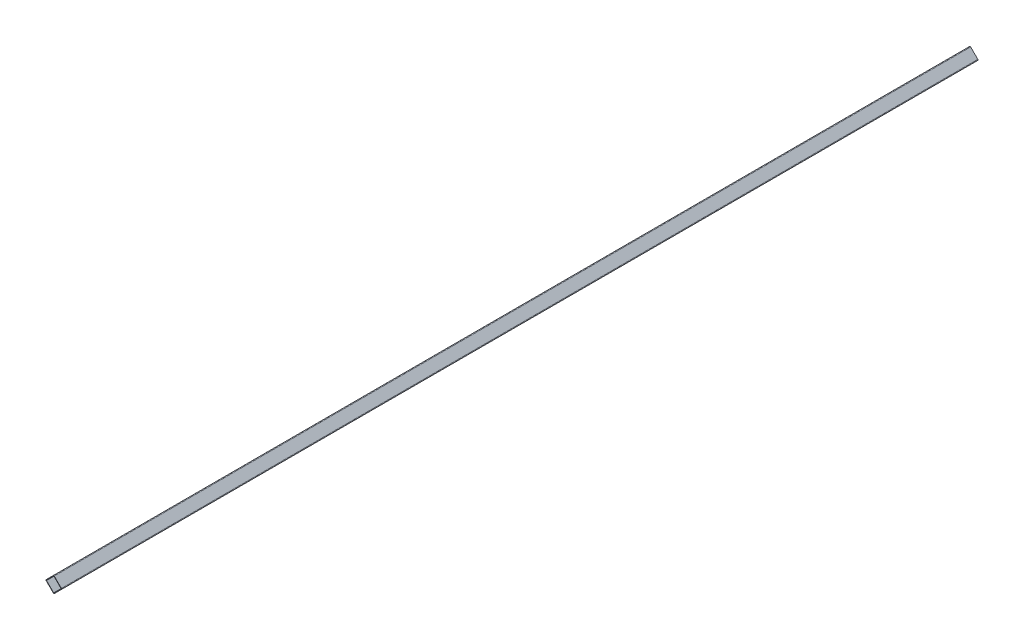
ISO-10303-21;
HEADER;
FILE_DESCRIPTION(('STEP AP214'),'2;1');
FILE_NAME('part.step','',(''),(''),'','','');
FILE_SCHEMA(('AUTOMOTIVE_DESIGN { 1 0 10303 214 1 1 1 1 }'));
ENDSEC;
DATA;
#1=APPLICATION_CONTEXT('core data for automotive mechanical design processes');
#2=APPLICATION_PROTOCOL_DEFINITION('international standard','automotive_design',2000,#1);
#3=PRODUCT_CONTEXT('',#1,'mechanical');
#4=PRODUCT('Part','Part','',(#3));
#5=PRODUCT_RELATED_PRODUCT_CATEGORY('part','',(#4));
#6=PRODUCT_DEFINITION_FORMATION('','',#4);
#7=PRODUCT_DEFINITION_CONTEXT('part definition',#1,'design');
#8=PRODUCT_DEFINITION('design','',#6,#7);
#9=PRODUCT_DEFINITION_SHAPE('','',#8);
#10=(LENGTH_UNIT() NAMED_UNIT(*) SI_UNIT(.MILLI.,.METRE.));
#11=(NAMED_UNIT(*) PLANE_ANGLE_UNIT() SI_UNIT($,.RADIAN.));
#12=(NAMED_UNIT(*) SI_UNIT($,.STERADIAN.) SOLID_ANGLE_UNIT());
#13=UNCERTAINTY_MEASURE_WITH_UNIT(LENGTH_MEASURE(1.E-05),#10,'distance_accuracy_value','');
#14=(GEOMETRIC_REPRESENTATION_CONTEXT(3) GLOBAL_UNCERTAINTY_ASSIGNED_CONTEXT((#13)) GLOBAL_UNIT_ASSIGNED_CONTEXT((#10,
#11,#12)) REPRESENTATION_CONTEXT('',''));
#15=CARTESIAN_POINT('',(0.,0.,0.));
#16=DIRECTION('',(0.,0.,1.));
#17=DIRECTION('',(1.,0.,0.));
#18=AXIS2_PLACEMENT_3D('',#15,#16,#17);
#19=CARTESIAN_POINT('',(0.,-23.5466558135256,3048.));
#20=DIRECTION('',(0.,0.,-1.));
#21=DIRECTION('',(-1.,0.,0.));
#22=AXIS2_PLACEMENT_3D('',#19,#20,#21);
#23=PLANE('',#22);
#24=CARTESIAN_POINT('',(0.,-23.5466558135256,3048.));
#25=DIRECTION('',(0.,0.,1.));
#26=DIRECTION('',(-1.,0.,0.));
#27=AXIS2_PLACEMENT_3D('',#24,#25,#26);
#28=CIRCLE('',#27,2.3999999999904);
#29=CARTESIAN_POINT('',(-1.69705627484088,-25.2437120883665,3048.));
#30=VERTEX_POINT('',#29);
#31=CARTESIAN_POINT('',(1.69705627484097,-25.2437120883665,3048.));
#32=VERTEX_POINT('',#31);
#33=EDGE_CURVE('E219',#30,#32,#28,.T.);
#34=ORIENTED_EDGE('',*,*,#33,.T.);
#35=DIRECTION('',(0.707106781186546,0.707106781186549,0.));
#36=VECTOR('',#35,1.);
#37=CARTESIAN_POINT('',(25.2437120883665,-1.69705627484088,3048.));
#38=LINE('',#37,#36);
#39=CARTESIAN_POINT('',(25.2437120883665,-1.69705627484088,3048.));
#40=VERTEX_POINT('',#39);
#41=EDGE_CURVE('E222',#32,#40,#38,.T.);
#42=ORIENTED_EDGE('',*,*,#41,.T.);
#43=CARTESIAN_POINT('',(23.5466558135256,0.,3048.));
#44=DIRECTION('',(0.,0.,1.));
#45=DIRECTION('',(1.,0.,0.));
#46=AXIS2_PLACEMENT_3D('',#43,#44,#45);
#47=CIRCLE('',#46,2.3999999999904);
#48=CARTESIAN_POINT('',(25.2437120883665,1.69705627484098,3048.));
#49=VERTEX_POINT('',#48);
#50=EDGE_CURVE('E225',#40,#49,#47,.T.);
#51=ORIENTED_EDGE('',*,*,#50,.T.);
#52=DIRECTION('',(-0.707106781186549,0.707106781186546,0.));
#53=VECTOR('',#52,1.);
#54=CARTESIAN_POINT('',(25.2437120883665,1.69705627484098,3048.));
#55=LINE('',#54,#53);
#56=CARTESIAN_POINT('',(1.69705627484088,25.2437120883665,3048.));
#57=VERTEX_POINT('',#56);
#58=EDGE_CURVE('E227',#49,#57,#55,.T.);
#59=ORIENTED_EDGE('',*,*,#58,.T.);
#60=CARTESIAN_POINT('',(0.,23.5466558135256,3048.));
#61=DIRECTION('',(0.,0.,1.));
#62=DIRECTION('',(1.,0.,0.));
#63=AXIS2_PLACEMENT_3D('',#60,#61,#62);
#64=CIRCLE('',#63,2.3999999999904);
#65=CARTESIAN_POINT('',(-1.69705627484097,25.2437120883665,3048.));
#66=VERTEX_POINT('',#65);
#67=EDGE_CURVE('E229',#57,#66,#64,.T.);
#68=ORIENTED_EDGE('',*,*,#67,.T.);
#69=DIRECTION('',(-0.707106781186546,-0.707106781186549,0.));
#70=VECTOR('',#69,1.);
#71=CARTESIAN_POINT('',(-1.69705627484097,25.2437120883665,3048.));
#72=LINE('',#71,#70);
#73=CARTESIAN_POINT('',(-25.2437120883665,1.69705627484088,3048.));
#74=VERTEX_POINT('',#73);
#75=EDGE_CURVE('E231',#66,#74,#72,.T.);
#76=ORIENTED_EDGE('',*,*,#75,.T.);
#77=CARTESIAN_POINT('',(-23.5466558135256,0.,3048.));
#78=DIRECTION('',(0.,0.,1.));
#79=DIRECTION('',(1.,0.,0.));
#80=AXIS2_PLACEMENT_3D('',#77,#78,#79);
#81=CIRCLE('',#80,2.3999999999904);
#82=CARTESIAN_POINT('',(-25.2437120883665,-1.69705627484098,3048.));
#83=VERTEX_POINT('',#82);
#84=EDGE_CURVE('E233',#74,#83,#81,.T.);
#85=ORIENTED_EDGE('',*,*,#84,.T.);
#86=DIRECTION('',(0.707106781186549,-0.707106781186546,0.));
#87=VECTOR('',#86,1.);
#88=CARTESIAN_POINT('',(-1.69705627484088,-25.2437120883665,3048.));
#89=LINE('',#88,#87);
#90=EDGE_CURVE('E235',#83,#30,#89,.T.);
#91=ORIENTED_EDGE('',*,*,#90,.T.);
#92=EDGE_LOOP('',(#34,#42,#51,#59,#68,#76,#85,#91));
#93=FACE_BOUND('',#92,.T.);
#94=CARTESIAN_POINT('',(0.,23.5466558135166,3048.));
#95=DIRECTION('',(0.,0.,1.));
#96=DIRECTION('',(-1.,0.,0.));
#97=AXIS2_PLACEMENT_3D('',#94,#95,#96);
#98=CIRCLE('',#97,0.799999999996809);
#99=CARTESIAN_POINT('',(0.565685424946933,24.1123412384635,3048.));
#100=VERTEX_POINT('',#99);
#101=CARTESIAN_POINT('',(-0.565685424947032,24.1123412384636,3048.));
#102=VERTEX_POINT('',#101);
#103=EDGE_CURVE('E154',#100,#102,#98,.T.);
#104=ORIENTED_EDGE('',*,*,#103,.F.);
#105=DIRECTION('',(-0.707106781186549,0.707106781186546,0.));
#106=VECTOR('',#105,1.);
#107=CARTESIAN_POINT('',(0.565685424946933,24.1123412384635,3048.));
#108=LINE('',#107,#106);
#109=CARTESIAN_POINT('',(24.1123412384635,0.565685424947045,3048.));
#110=VERTEX_POINT('',#109);
#111=EDGE_CURVE('E187',#110,#100,#108,.T.);
#112=ORIENTED_EDGE('',*,*,#111,.F.);
#113=CARTESIAN_POINT('',(23.5466558135166,0.,3048.));
#114=DIRECTION('',(0.,0.,1.));
#115=DIRECTION('',(1.,0.,0.));
#116=AXIS2_PLACEMENT_3D('',#113,#114,#115);
#117=CIRCLE('',#116,0.799999999996815);
#118=CARTESIAN_POINT('',(24.1123412384636,-0.565685424946935,3048.));
#119=VERTEX_POINT('',#118);
#120=EDGE_CURVE('E185',#119,#110,#117,.T.);
#121=ORIENTED_EDGE('',*,*,#120,.F.);
#122=DIRECTION('',(0.707106781186546,0.707106781186549,0.));
#123=VECTOR('',#122,1.);
#124=CARTESIAN_POINT('',(0.56568542494703,-24.1123412384635,3048.));
#125=LINE('',#124,#123);
#126=CARTESIAN_POINT('',(0.565685424947029,-24.1123412384635,3048.));
#127=VERTEX_POINT('',#126);
#128=EDGE_CURVE('E183',#127,#119,#125,.T.);
#129=ORIENTED_EDGE('',*,*,#128,.F.);
#130=CARTESIAN_POINT('',(0.,-23.5466558135166,3048.));
#131=DIRECTION('',(0.,0.,1.));
#132=DIRECTION('',(1.,0.,0.));
#133=AXIS2_PLACEMENT_3D('',#130,#131,#132);
#134=CIRCLE('',#133,0.799999999996814);
#135=CARTESIAN_POINT('',(-0.565685424946933,-24.1123412384636,3048.));
#136=VERTEX_POINT('',#135);
#137=EDGE_CURVE('E181',#136,#127,#134,.T.);
#138=ORIENTED_EDGE('',*,*,#137,.F.);
#139=DIRECTION('',(0.707106781186549,-0.707106781186546,0.));
#140=VECTOR('',#139,1.);
#141=CARTESIAN_POINT('',(-24.1123412384635,-0.565685424947029,3048.));
#142=LINE('',#141,#140);
#143=CARTESIAN_POINT('',(-24.1123412384635,-0.565685424947027,3048.));
#144=VERTEX_POINT('',#143);
#145=EDGE_CURVE('E177',#144,#136,#142,.T.);
#146=ORIENTED_EDGE('',*,*,#145,.F.);
#147=CARTESIAN_POINT('',(-23.5466558135166,0.,3048.));
#148=DIRECTION('',(0.,0.,1.));
#149=DIRECTION('',(1.,0.,0.));
#150=AXIS2_PLACEMENT_3D('',#147,#148,#149);
#151=CIRCLE('',#150,0.799999999996812);
#152=CARTESIAN_POINT('',(-24.1123412384635,0.565685424946937,3048.));
#153=VERTEX_POINT('',#152);
#154=EDGE_CURVE('E175',#153,#144,#151,.T.);
#155=ORIENTED_EDGE('',*,*,#154,.F.);
#156=DIRECTION('',(-0.707106781186546,-0.707106781186549,0.));
#157=VECTOR('',#156,1.);
#158=CARTESIAN_POINT('',(-24.1123412384635,0.565685424946937,3048.));
#159=LINE('',#158,#157);
#160=EDGE_CURVE('E162',#102,#153,#159,.T.);
#161=ORIENTED_EDGE('',*,*,#160,.F.);
#162=EDGE_LOOP('',(#104,#112,#121,#129,#138,#146,#155,#161));
#163=FACE_BOUND('',#162,.T.);
#164=ADVANCED_FACE('F41',(#93,#163),#23,.F.);
#165=CARTESIAN_POINT('',(0.,-23.5466558135256,0.));
#166=DIRECTION('',(0.,0.,-1.));
#167=DIRECTION('',(-1.,0.,0.));
#168=AXIS2_PLACEMENT_3D('',#165,#166,#167);
#169=PLANE('',#168);
#170=CARTESIAN_POINT('',(0.,-23.5466558135256,0.));
#171=DIRECTION('',(0.,0.,1.));
#172=DIRECTION('',(-1.,0.,0.));
#173=AXIS2_PLACEMENT_3D('',#170,#171,#172);
#174=CIRCLE('',#173,2.3999999999904);
#175=CARTESIAN_POINT('',(-1.69705627484088,-25.2437120883665,0.));
#176=VERTEX_POINT('',#175);
#177=CARTESIAN_POINT('',(1.69705627484097,-25.2437120883665,0.));
#178=VERTEX_POINT('',#177);
#179=EDGE_CURVE('E170',#176,#178,#174,.T.);
#180=ORIENTED_EDGE('',*,*,#179,.F.);
#181=DIRECTION('',(0.707106781186549,-0.707106781186546,0.));
#182=VECTOR('',#181,1.);
#183=CARTESIAN_POINT('',(-1.69705627484088,-25.2437120883665,0.));
#184=LINE('',#183,#182);
#185=CARTESIAN_POINT('',(-25.2437120883665,-1.69705627484098,0.));
#186=VERTEX_POINT('',#185);
#187=EDGE_CURVE('E223',#186,#176,#184,.T.);
#188=ORIENTED_EDGE('',*,*,#187,.F.);
#189=CARTESIAN_POINT('',(-23.5466558135256,0.,0.));
#190=DIRECTION('',(0.,0.,1.));
#191=DIRECTION('',(1.,0.,0.));
#192=AXIS2_PLACEMENT_3D('',#189,#190,#191);
#193=CIRCLE('',#192,2.3999999999904);
#194=CARTESIAN_POINT('',(-25.2437120883665,1.69705627484088,0.));
#195=VERTEX_POINT('',#194);
#196=EDGE_CURVE('E250',#195,#186,#193,.T.);
#197=ORIENTED_EDGE('',*,*,#196,.F.);
#198=DIRECTION('',(-0.707106781186546,-0.707106781186549,0.));
#199=VECTOR('',#198,1.);
#200=CARTESIAN_POINT('',(-1.69705627484097,25.2437120883665,0.));
#201=LINE('',#200,#199);
#202=CARTESIAN_POINT('',(-1.69705627484097,25.2437120883665,0.));
#203=VERTEX_POINT('',#202);
#204=EDGE_CURVE('E248',#203,#195,#201,.T.);
#205=ORIENTED_EDGE('',*,*,#204,.F.);
#206=CARTESIAN_POINT('',(0.,23.5466558135256,0.));
#207=DIRECTION('',(0.,0.,1.));
#208=DIRECTION('',(1.,0.,0.));
#209=AXIS2_PLACEMENT_3D('',#206,#207,#208);
#210=CIRCLE('',#209,2.3999999999904);
#211=CARTESIAN_POINT('',(1.69705627484088,25.2437120883665,0.));
#212=VERTEX_POINT('',#211);
#213=EDGE_CURVE('E246',#212,#203,#210,.T.);
#214=ORIENTED_EDGE('',*,*,#213,.F.);
#215=DIRECTION('',(-0.707106781186549,0.707106781186546,0.));
#216=VECTOR('',#215,1.);
#217=CARTESIAN_POINT('',(25.2437120883665,1.69705627484098,0.));
#218=LINE('',#217,#216);
#219=CARTESIAN_POINT('',(25.2437120883665,1.69705627484098,0.));
#220=VERTEX_POINT('',#219);
#221=EDGE_CURVE('E244',#220,#212,#218,.T.);
#222=ORIENTED_EDGE('',*,*,#221,.F.);
#223=CARTESIAN_POINT('',(23.5466558135256,0.,0.));
#224=DIRECTION('',(0.,0.,1.));
#225=DIRECTION('',(1.,0.,0.));
#226=AXIS2_PLACEMENT_3D('',#223,#224,#225);
#227=CIRCLE('',#226,2.3999999999904);
#228=CARTESIAN_POINT('',(25.2437120883665,-1.69705627484088,0.));
#229=VERTEX_POINT('',#228);
#230=EDGE_CURVE('E242',#229,#220,#227,.T.);
#231=ORIENTED_EDGE('',*,*,#230,.F.);
#232=DIRECTION('',(0.707106781186546,0.707106781186549,0.));
#233=VECTOR('',#232,1.);
#234=CARTESIAN_POINT('',(25.2437120883665,-1.69705627484088,0.));
#235=LINE('',#234,#233);
#236=EDGE_CURVE('E240',#178,#229,#235,.T.);
#237=ORIENTED_EDGE('',*,*,#236,.F.);
#238=EDGE_LOOP('',(#180,#188,#197,#205,#214,#222,#231,#237));
#239=FACE_BOUND('',#238,.T.);
#240=DIRECTION('',(-0.707106781186549,0.707106781186546,0.));
#241=VECTOR('',#240,1.);
#242=CARTESIAN_POINT('',(0.565685424946933,24.1123412384635,0.));
#243=LINE('',#242,#241);
#244=CARTESIAN_POINT('',(24.1123412384635,0.565685424947024,0.));
#245=VERTEX_POINT('',#244);
#246=CARTESIAN_POINT('',(0.565685424946942,24.1123412384635,0.));
#247=VERTEX_POINT('',#246);
#248=EDGE_CURVE('E163',#245,#247,#243,.T.);
#249=ORIENTED_EDGE('',*,*,#248,.T.);
#250=CARTESIAN_POINT('',(0.,23.5466558135166,0.));
#251=DIRECTION('',(0.,0.,1.));
#252=DIRECTION('',(-1.,0.,0.));
#253=AXIS2_PLACEMENT_3D('',#250,#251,#252);
#254=CIRCLE('',#253,0.799999999996809);
#255=CARTESIAN_POINT('',(-0.565685424947032,24.1123412384636,0.));
#256=VERTEX_POINT('',#255);
#257=EDGE_CURVE('E64',#247,#256,#254,.T.);
#258=ORIENTED_EDGE('',*,*,#257,.T.);
#259=DIRECTION('',(-0.707106781186546,-0.707106781186549,0.));
#260=VECTOR('',#259,1.);
#261=CARTESIAN_POINT('',(-24.1123412384635,0.565685424946937,0.));
#262=LINE('',#261,#260);
#263=CARTESIAN_POINT('',(-24.1123412384635,0.565685424946937,0.));
#264=VERTEX_POINT('',#263);
#265=EDGE_CURVE('E169',#256,#264,#262,.T.);
#266=ORIENTED_EDGE('',*,*,#265,.T.);
#267=CARTESIAN_POINT('',(-23.5466558135166,0.,0.));
#268=DIRECTION('',(0.,0.,1.));
#269=DIRECTION('',(1.,0.,0.));
#270=AXIS2_PLACEMENT_3D('',#267,#268,#269);
#271=CIRCLE('',#270,0.799999999996812);
#272=CARTESIAN_POINT('',(-24.1123412384635,-0.565685424947027,0.));
#273=VERTEX_POINT('',#272);
#274=EDGE_CURVE('E191',#264,#273,#271,.T.);
#275=ORIENTED_EDGE('',*,*,#274,.T.);
#276=DIRECTION('',(0.707106781186549,-0.707106781186546,0.));
#277=VECTOR('',#276,1.);
#278=CARTESIAN_POINT('',(-24.1123412384635,-0.565685424947029,0.));
#279=LINE('',#278,#277);
#280=CARTESIAN_POINT('',(-0.565685424946933,-24.1123412384636,0.));
#281=VERTEX_POINT('',#280);
#282=EDGE_CURVE('E194',#273,#281,#279,.T.);
#283=ORIENTED_EDGE('',*,*,#282,.T.);
#284=CARTESIAN_POINT('',(0.,-23.5466558135166,0.));
#285=DIRECTION('',(0.,0.,1.));
#286=DIRECTION('',(1.,0.,0.));
#287=AXIS2_PLACEMENT_3D('',#284,#285,#286);
#288=CIRCLE('',#287,0.799999999996814);
#289=CARTESIAN_POINT('',(0.565685424947029,-24.1123412384635,0.));
#290=VERTEX_POINT('',#289);
#291=EDGE_CURVE('E197',#281,#290,#288,.T.);
#292=ORIENTED_EDGE('',*,*,#291,.T.);
#293=DIRECTION('',(0.707106781186546,0.707106781186549,0.));
#294=VECTOR('',#293,1.);
#295=CARTESIAN_POINT('',(0.56568542494703,-24.1123412384635,0.));
#296=LINE('',#295,#294);
#297=CARTESIAN_POINT('',(24.1123412384636,-0.565685424946935,0.));
#298=VERTEX_POINT('',#297);
#299=EDGE_CURVE('E200',#290,#298,#296,.T.);
#300=ORIENTED_EDGE('',*,*,#299,.T.);
#301=CARTESIAN_POINT('',(23.5466558135166,0.,0.));
#302=DIRECTION('',(0.,0.,1.));
#303=DIRECTION('',(1.,0.,0.));
#304=AXIS2_PLACEMENT_3D('',#301,#302,#303);
#305=CIRCLE('',#304,0.799999999996815);
#306=EDGE_CURVE('E203',#298,#245,#305,.T.);
#307=ORIENTED_EDGE('',*,*,#306,.T.);
#308=EDGE_LOOP('',(#249,#258,#266,#275,#283,#292,#300,#307));
#309=FACE_BOUND('',#308,.T.);
#310=ADVANCED_FACE('F280',(#239,#309),#169,.T.);
#311=CARTESIAN_POINT('',(0.,-23.5466558135256,3048.));
#312=DIRECTION('',(0.,0.,-1.));
#313=DIRECTION('',(-1.,0.,0.));
#314=AXIS2_PLACEMENT_3D('',#311,#312,#313);
#315=CYLINDRICAL_SURFACE('',#314,2.3999999999904);
#316=ORIENTED_EDGE('',*,*,#179,.T.);
#317=DIRECTION('',(0.,0.,-1.));
#318=VECTOR('',#317,1.);
#319=CARTESIAN_POINT('',(1.69705627484097,-25.2437120883665,3048.));
#320=LINE('',#319,#318);
#321=EDGE_CURVE('E11',#32,#178,#320,.T.);
#322=ORIENTED_EDGE('',*,*,#321,.F.);
#323=ORIENTED_EDGE('',*,*,#33,.F.);
#324=DIRECTION('',(0.,0.,-1.));
#325=VECTOR('',#324,1.);
#326=CARTESIAN_POINT('',(-1.69705627484088,-25.2437120883665,3048.));
#327=LINE('',#326,#325);
#328=EDGE_CURVE('E237',#30,#176,#327,.T.);
#329=ORIENTED_EDGE('',*,*,#328,.T.);
#330=EDGE_LOOP('',(#316,#322,#323,#329));
#331=FACE_BOUND('',#330,.T.);
#332=ADVANCED_FACE('F43',(#331),#315,.T.);
#333=CARTESIAN_POINT('',(25.2437120883665,-1.69705627484088,3048.));
#334=DIRECTION('',(-0.707106781186549,0.707106781186546,0.));
#335=DIRECTION('',(-0.707106781186546,-0.707106781186549,0.));
#336=AXIS2_PLACEMENT_3D('',#333,#334,#335);
#337=PLANE('',#336);
#338=ORIENTED_EDGE('',*,*,#236,.T.);
#339=DIRECTION('',(0.,0.,-1.));
#340=VECTOR('',#339,1.);
#341=CARTESIAN_POINT('',(25.2437120883665,-1.69705627484088,3048.));
#342=LINE('',#341,#340);
#343=EDGE_CURVE('E49',#40,#229,#342,.T.);
#344=ORIENTED_EDGE('',*,*,#343,.F.);
#345=ORIENTED_EDGE('',*,*,#41,.F.);
#346=ORIENTED_EDGE('',*,*,#321,.T.);
#347=EDGE_LOOP('',(#338,#344,#345,#346));
#348=FACE_BOUND('',#347,.T.);
#349=ADVANCED_FACE('F297',(#348),#337,.F.);
#350=CARTESIAN_POINT('',(23.5466558135256,0.,3048.));
#351=DIRECTION('',(0.,0.,-1.));
#352=DIRECTION('',(-1.,0.,0.));
#353=AXIS2_PLACEMENT_3D('',#350,#351,#352);
#354=CYLINDRICAL_SURFACE('',#353,2.3999999999904);
#355=ORIENTED_EDGE('',*,*,#230,.T.);
#356=DIRECTION('',(0.,0.,-1.));
#357=VECTOR('',#356,1.);
#358=CARTESIAN_POINT('',(25.2437120883665,1.69705627484098,3048.));
#359=LINE('',#358,#357);
#360=EDGE_CURVE('E267',#49,#220,#359,.T.);
#361=ORIENTED_EDGE('',*,*,#360,.F.);
#362=ORIENTED_EDGE('',*,*,#50,.F.);
#363=ORIENTED_EDGE('',*,*,#343,.T.);
#364=EDGE_LOOP('',(#355,#361,#362,#363));
#365=FACE_BOUND('',#364,.T.);
#366=ADVANCED_FACE('F274',(#365),#354,.T.);
#367=CARTESIAN_POINT('',(25.2437120883665,1.69705627484098,3048.));
#368=DIRECTION('',(-0.707106781186546,-0.707106781186549,0.));
#369=DIRECTION('',(0.707106781186549,-0.707106781186546,0.));
#370=AXIS2_PLACEMENT_3D('',#367,#368,#369);
#371=PLANE('',#370);
#372=ORIENTED_EDGE('',*,*,#221,.T.);
#373=DIRECTION('',(0.,0.,-1.));
#374=VECTOR('',#373,1.);
#375=CARTESIAN_POINT('',(1.69705627484088,25.2437120883665,3048.));
#376=LINE('',#375,#374);
#377=EDGE_CURVE('E264',#57,#212,#376,.T.);
#378=ORIENTED_EDGE('',*,*,#377,.F.);
#379=ORIENTED_EDGE('',*,*,#58,.F.);
#380=ORIENTED_EDGE('',*,*,#360,.T.);
#381=EDGE_LOOP('',(#372,#378,#379,#380));
#382=FACE_BOUND('',#381,.T.);
#383=ADVANCED_FACE('F286',(#382),#371,.F.);
#384=CARTESIAN_POINT('',(0.,23.5466558135256,3048.));
#385=DIRECTION('',(0.,0.,-1.));
#386=DIRECTION('',(-1.,0.,0.));
#387=AXIS2_PLACEMENT_3D('',#384,#385,#386);
#388=CYLINDRICAL_SURFACE('',#387,2.3999999999904);
#389=ORIENTED_EDGE('',*,*,#213,.T.);
#390=DIRECTION('',(0.,0.,-1.));
#391=VECTOR('',#390,1.);
#392=CARTESIAN_POINT('',(-1.69705627484097,25.2437120883665,3048.));
#393=LINE('',#392,#391);
#394=EDGE_CURVE('E261',#66,#203,#393,.T.);
#395=ORIENTED_EDGE('',*,*,#394,.F.);
#396=ORIENTED_EDGE('',*,*,#67,.F.);
#397=ORIENTED_EDGE('',*,*,#377,.T.);
#398=EDGE_LOOP('',(#389,#395,#396,#397));
#399=FACE_BOUND('',#398,.T.);
#400=ADVANCED_FACE('F290',(#399),#388,.T.);
#401=CARTESIAN_POINT('',(-1.69705627484097,25.2437120883665,3048.));
#402=DIRECTION('',(0.707106781186549,-0.707106781186546,0.));
#403=DIRECTION('',(0.707106781186546,0.707106781186549,0.));
#404=AXIS2_PLACEMENT_3D('',#401,#402,#403);
#405=PLANE('',#404);
#406=ORIENTED_EDGE('',*,*,#204,.T.);
#407=DIRECTION('',(0.,0.,-1.));
#408=VECTOR('',#407,1.);
#409=CARTESIAN_POINT('',(-25.2437120883665,1.69705627484088,3048.));
#410=LINE('',#409,#408);
#411=EDGE_CURVE('E258',#74,#195,#410,.T.);
#412=ORIENTED_EDGE('',*,*,#411,.F.);
#413=ORIENTED_EDGE('',*,*,#75,.F.);
#414=ORIENTED_EDGE('',*,*,#394,.T.);
#415=EDGE_LOOP('',(#406,#412,#413,#414));
#416=FACE_BOUND('',#415,.T.);
#417=ADVANCED_FACE('F310',(#416),#405,.F.);
#418=CARTESIAN_POINT('',(-23.5466558135256,0.,3048.));
#419=DIRECTION('',(0.,0.,-1.));
#420=DIRECTION('',(-1.,0.,0.));
#421=AXIS2_PLACEMENT_3D('',#418,#419,#420);
#422=CYLINDRICAL_SURFACE('',#421,2.3999999999904);
#423=ORIENTED_EDGE('',*,*,#196,.T.);
#424=DIRECTION('',(0.,0.,-1.));
#425=VECTOR('',#424,1.);
#426=CARTESIAN_POINT('',(-25.2437120883665,-1.69705627484098,3048.));
#427=LINE('',#426,#425);
#428=EDGE_CURVE('E255',#83,#186,#427,.T.);
#429=ORIENTED_EDGE('',*,*,#428,.F.);
#430=ORIENTED_EDGE('',*,*,#84,.F.);
#431=ORIENTED_EDGE('',*,*,#411,.T.);
#432=EDGE_LOOP('',(#423,#429,#430,#431));
#433=FACE_BOUND('',#432,.T.);
#434=ADVANCED_FACE('F308',(#433),#422,.T.);
#435=CARTESIAN_POINT('',(-1.69705627484088,-25.2437120883665,3048.));
#436=DIRECTION('',(0.707106781186546,0.707106781186549,0.));
#437=DIRECTION('',(-0.707106781186549,0.707106781186546,0.));
#438=AXIS2_PLACEMENT_3D('',#435,#436,#437);
#439=PLANE('',#438);
#440=ORIENTED_EDGE('',*,*,#187,.T.);
#441=ORIENTED_EDGE('',*,*,#328,.F.);
#442=ORIENTED_EDGE('',*,*,#90,.F.);
#443=ORIENTED_EDGE('',*,*,#428,.T.);
#444=EDGE_LOOP('',(#440,#441,#442,#443));
#445=FACE_BOUND('',#444,.T.);
#446=ADVANCED_FACE('F303',(#445),#439,.F.);
#447=CARTESIAN_POINT('',(0.,23.5466558135166,3048.));
#448=DIRECTION('',(0.,0.,-1.));
#449=DIRECTION('',(-1.,0.,0.));
#450=AXIS2_PLACEMENT_3D('',#447,#448,#449);
#451=CYLINDRICAL_SURFACE('',#450,0.799999999996809);
#452=ORIENTED_EDGE('',*,*,#257,.F.);
#453=DIRECTION('',(0.,0.,-1.));
#454=VECTOR('',#453,1.);
#455=CARTESIAN_POINT('',(0.565685424946933,24.1123412384635,3048.));
#456=LINE('',#455,#454);
#457=EDGE_CURVE('E158',#100,#247,#456,.T.);
#458=ORIENTED_EDGE('',*,*,#457,.F.);
#459=ORIENTED_EDGE('',*,*,#103,.T.);
#460=DIRECTION('',(0.,0.,-1.));
#461=VECTOR('',#460,1.);
#462=CARTESIAN_POINT('',(-0.565685424947032,24.1123412384636,3048.));
#463=LINE('',#462,#461);
#464=EDGE_CURVE('E157',#102,#256,#463,.T.);
#465=ORIENTED_EDGE('',*,*,#464,.T.);
#466=EDGE_LOOP('',(#452,#458,#459,#465));
#467=FACE_BOUND('',#466,.T.);
#468=ADVANCED_FACE('F156',(#467),#451,.F.);
#469=CARTESIAN_POINT('',(-24.1123412384635,0.565685424946937,3048.));
#470=DIRECTION('',(0.707106781186549,-0.707106781186546,0.));
#471=DIRECTION('',(0.707106781186546,0.707106781186549,0.));
#472=AXIS2_PLACEMENT_3D('',#469,#470,#471);
#473=PLANE('',#472);
#474=ORIENTED_EDGE('',*,*,#265,.F.);
#475=ORIENTED_EDGE('',*,*,#464,.F.);
#476=ORIENTED_EDGE('',*,*,#160,.T.);
#477=DIRECTION('',(0.,0.,-1.));
#478=VECTOR('',#477,1.);
#479=CARTESIAN_POINT('',(-24.1123412384635,0.565685424946937,3048.));
#480=LINE('',#479,#478);
#481=EDGE_CURVE('E171',#153,#264,#480,.T.);
#482=ORIENTED_EDGE('',*,*,#481,.T.);
#483=EDGE_LOOP('',(#474,#475,#476,#482));
#484=FACE_BOUND('',#483,.T.);
#485=ADVANCED_FACE('F166',(#484),#473,.T.);
#486=CARTESIAN_POINT('',(-23.5466558135166,0.,3048.));
#487=DIRECTION('',(0.,0.,-1.));
#488=DIRECTION('',(-1.,0.,0.));
#489=AXIS2_PLACEMENT_3D('',#486,#487,#488);
#490=CYLINDRICAL_SURFACE('',#489,0.799999999996812);
#491=ORIENTED_EDGE('',*,*,#274,.F.);
#492=ORIENTED_EDGE('',*,*,#481,.F.);
#493=ORIENTED_EDGE('',*,*,#154,.T.);
#494=DIRECTION('',(0.,0.,-1.));
#495=VECTOR('',#494,1.);
#496=CARTESIAN_POINT('',(-24.1123412384635,-0.565685424947027,3048.));
#497=LINE('',#496,#495);
#498=EDGE_CURVE('E216',#144,#273,#497,.T.);
#499=ORIENTED_EDGE('',*,*,#498,.T.);
#500=EDGE_LOOP('',(#491,#492,#493,#499));
#501=FACE_BOUND('',#500,.T.);
#502=ADVANCED_FACE('F335',(#501),#490,.F.);
#503=CARTESIAN_POINT('',(-24.1123412384635,-0.565685424947029,3048.));
#504=DIRECTION('',(0.707106781186546,0.707106781186549,0.));
#505=DIRECTION('',(-0.707106781186549,0.707106781186546,0.));
#506=AXIS2_PLACEMENT_3D('',#503,#504,#505);
#507=PLANE('',#506);
#508=ORIENTED_EDGE('',*,*,#282,.F.);
#509=ORIENTED_EDGE('',*,*,#498,.F.);
#510=ORIENTED_EDGE('',*,*,#145,.T.);
#511=DIRECTION('',(0.,0.,-1.));
#512=VECTOR('',#511,1.);
#513=CARTESIAN_POINT('',(-0.565685424946933,-24.1123412384636,3048.));
#514=LINE('',#513,#512);
#515=EDGE_CURVE('E214',#136,#281,#514,.T.);
#516=ORIENTED_EDGE('',*,*,#515,.T.);
#517=EDGE_LOOP('',(#508,#509,#510,#516));
#518=FACE_BOUND('',#517,.T.);
#519=ADVANCED_FACE('F339',(#518),#507,.T.);
#520=CARTESIAN_POINT('',(0.,-23.5466558135166,3048.));
#521=DIRECTION('',(0.,0.,-1.));
#522=DIRECTION('',(-1.,0.,0.));
#523=AXIS2_PLACEMENT_3D('',#520,#521,#522);
#524=CYLINDRICAL_SURFACE('',#523,0.799999999996814);
#525=ORIENTED_EDGE('',*,*,#291,.F.);
#526=ORIENTED_EDGE('',*,*,#515,.F.);
#527=ORIENTED_EDGE('',*,*,#137,.T.);
#528=DIRECTION('',(0.,0.,-1.));
#529=VECTOR('',#528,1.);
#530=CARTESIAN_POINT('',(0.565685424947029,-24.1123412384635,3048.));
#531=LINE('',#530,#529);
#532=EDGE_CURVE('E212',#127,#290,#531,.T.);
#533=ORIENTED_EDGE('',*,*,#532,.T.);
#534=EDGE_LOOP('',(#525,#526,#527,#533));
#535=FACE_BOUND('',#534,.T.);
#536=ADVANCED_FACE('F345',(#535),#524,.F.);
#537=CARTESIAN_POINT('',(0.56568542494703,-24.1123412384635,3048.));
#538=DIRECTION('',(-0.707106781186549,0.707106781186546,0.));
#539=DIRECTION('',(-0.707106781186546,-0.707106781186549,0.));
#540=AXIS2_PLACEMENT_3D('',#537,#538,#539);
#541=PLANE('',#540);
#542=ORIENTED_EDGE('',*,*,#299,.F.);
#543=ORIENTED_EDGE('',*,*,#532,.F.);
#544=ORIENTED_EDGE('',*,*,#128,.T.);
#545=DIRECTION('',(0.,0.,-1.));
#546=VECTOR('',#545,1.);
#547=CARTESIAN_POINT('',(24.1123412384636,-0.565685424946935,3048.));
#548=LINE('',#547,#546);
#549=EDGE_CURVE('E210',#119,#298,#548,.T.);
#550=ORIENTED_EDGE('',*,*,#549,.T.);
#551=EDGE_LOOP('',(#542,#543,#544,#550));
#552=FACE_BOUND('',#551,.T.);
#553=ADVANCED_FACE('F349',(#552),#541,.T.);
#554=CARTESIAN_POINT('',(23.5466558135166,0.,3048.));
#555=DIRECTION('',(0.,0.,-1.));
#556=DIRECTION('',(-1.,0.,0.));
#557=AXIS2_PLACEMENT_3D('',#554,#555,#556);
#558=CYLINDRICAL_SURFACE('',#557,0.799999999996815);
#559=ORIENTED_EDGE('',*,*,#306,.F.);
#560=ORIENTED_EDGE('',*,*,#549,.F.);
#561=ORIENTED_EDGE('',*,*,#120,.T.);
#562=DIRECTION('',(0.,0.,-1.));
#563=VECTOR('',#562,1.);
#564=CARTESIAN_POINT('',(24.1123412384635,0.565685424947024,3048.));
#565=LINE('',#564,#563);
#566=EDGE_CURVE('E56',#110,#245,#565,.T.);
#567=ORIENTED_EDGE('',*,*,#566,.T.);
#568=EDGE_LOOP('',(#559,#560,#561,#567));
#569=FACE_BOUND('',#568,.T.);
#570=ADVANCED_FACE('F353',(#569),#558,.F.);
#571=CARTESIAN_POINT('',(0.565685424946933,24.1123412384635,3048.));
#572=DIRECTION('',(-0.707106781186546,-0.707106781186549,0.));
#573=DIRECTION('',(0.707106781186549,-0.707106781186546,0.));
#574=AXIS2_PLACEMENT_3D('',#571,#572,#573);
#575=PLANE('',#574);
#576=ORIENTED_EDGE('',*,*,#248,.F.);
#577=ORIENTED_EDGE('',*,*,#566,.F.);
#578=ORIENTED_EDGE('',*,*,#111,.T.);
#579=ORIENTED_EDGE('',*,*,#457,.T.);
#580=EDGE_LOOP('',(#576,#577,#578,#579));
#581=FACE_BOUND('',#580,.T.);
#582=ADVANCED_FACE('F357',(#581),#575,.T.);
#583=CLOSED_SHELL('',(#164,#310,#332,#349,#366,#383,#400,#417,#434,#446,#468,#485,#502,#519,
#536,#553,#570,#582));
#584=MANIFOLD_SOLID_BREP('B2',#583);
#585=ADVANCED_BREP_SHAPE_REPRESENTATION('',(#18,#584),#14);
#586=SHAPE_DEFINITION_REPRESENTATION(#9,#585);
ENDSEC;
END-ISO-10303-21;
